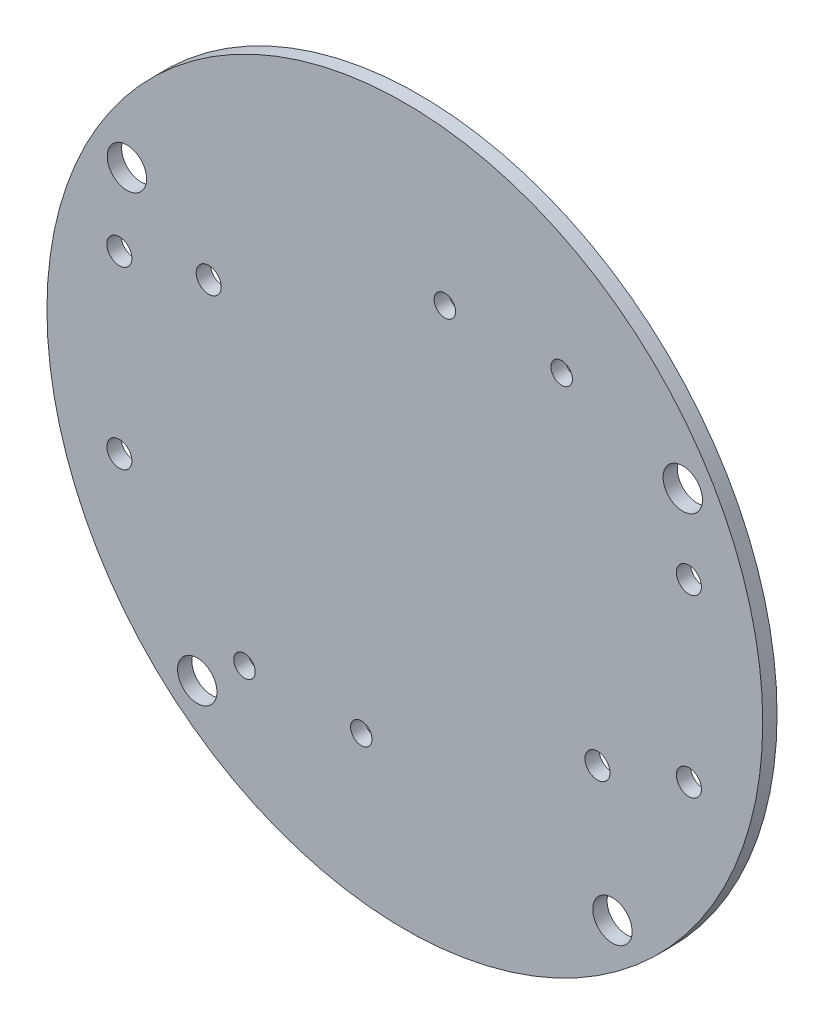
ISO-10303-21;
HEADER;
FILE_DESCRIPTION(('STEP AP214'),'2;1');
FILE_NAME('part.step','',(''),(''),'','','');
FILE_SCHEMA(('AUTOMOTIVE_DESIGN { 1 0 10303 214 1 1 1 1 }'));
ENDSEC;
DATA;
#1=APPLICATION_CONTEXT('core data for automotive mechanical design processes');
#2=APPLICATION_PROTOCOL_DEFINITION('international standard','automotive_design',2000,#1);
#3=PRODUCT_CONTEXT('',#1,'mechanical');
#4=PRODUCT('Part','Part','',(#3));
#5=PRODUCT_RELATED_PRODUCT_CATEGORY('part','',(#4));
#6=PRODUCT_DEFINITION_FORMATION('','',#4);
#7=PRODUCT_DEFINITION_CONTEXT('part definition',#1,'design');
#8=PRODUCT_DEFINITION('design','',#6,#7);
#9=PRODUCT_DEFINITION_SHAPE('','',#8);
#10=(LENGTH_UNIT() NAMED_UNIT(*) SI_UNIT(.MILLI.,.METRE.));
#11=(NAMED_UNIT(*) PLANE_ANGLE_UNIT() SI_UNIT($,.RADIAN.));
#12=(NAMED_UNIT(*) SI_UNIT($,.STERADIAN.) SOLID_ANGLE_UNIT());
#13=UNCERTAINTY_MEASURE_WITH_UNIT(LENGTH_MEASURE(1.E-05),#10,'distance_accuracy_value','');
#14=(GEOMETRIC_REPRESENTATION_CONTEXT(3) GLOBAL_UNCERTAINTY_ASSIGNED_CONTEXT((#13)) GLOBAL_UNIT_ASSIGNED_CONTEXT((#10,
#11,#12)) REPRESENTATION_CONTEXT('',''));
#15=CARTESIAN_POINT('',(0.,0.,0.));
#16=DIRECTION('',(0.,0.,1.));
#17=DIRECTION('',(1.,0.,0.));
#18=AXIS2_PLACEMENT_3D('',#15,#16,#17);
#19=CARTESIAN_POINT('',(0.,0.,2.));
#20=DIRECTION('',(0.,0.,-1.));
#21=DIRECTION('',(-1.,0.,0.));
#22=AXIS2_PLACEMENT_3D('',#19,#20,#21);
#23=CYLINDRICAL_SURFACE('',#22,50.);
#24=CARTESIAN_POINT('',(0.,0.,2.));
#25=DIRECTION('',(0.,0.,1.));
#26=DIRECTION('',(1.,0.,0.));
#27=AXIS2_PLACEMENT_3D('',#24,#25,#26);
#28=CIRCLE('',#27,50.);
#29=CARTESIAN_POINT('',(50.,0.,2.));
#30=VERTEX_POINT('',#29);
#31=EDGE_CURVE('E10',#30,#30,#28,.T.);
#32=ORIENTED_EDGE('',*,*,#31,.F.);
#33=EDGE_LOOP('',(#32));
#34=FACE_BOUND('',#33,.T.);
#35=CARTESIAN_POINT('',(0.,0.,0.));
#36=DIRECTION('',(0.,0.,1.));
#37=DIRECTION('',(1.,0.,0.));
#38=AXIS2_PLACEMENT_3D('',#35,#36,#37);
#39=CIRCLE('',#38,50.);
#40=CARTESIAN_POINT('',(50.,0.,0.));
#41=VERTEX_POINT('',#40);
#42=EDGE_CURVE('E49',#41,#41,#39,.T.);
#43=ORIENTED_EDGE('',*,*,#42,.T.);
#44=EDGE_LOOP('',(#43));
#45=FACE_BOUND('',#44,.T.);
#46=ADVANCED_FACE('F41',(#34,#45),#23,.T.);
#47=CARTESIAN_POINT('',(0.,0.,2.));
#48=DIRECTION('',(0.,0.,1.));
#49=DIRECTION('',(1.,0.,0.));
#50=AXIS2_PLACEMENT_3D('',#47,#48,#49);
#51=PLANE('',#50);
#52=CARTESIAN_POINT('',(39.68,-12.34,2.));
#53=DIRECTION('',(0.,0.,1.));
#54=DIRECTION('',(1.,0.,0.));
#55=AXIS2_PLACEMENT_3D('',#52,#53,#54);
#56=CIRCLE('',#55,1.75);
#57=CARTESIAN_POINT('',(41.43,-12.34,2.));
#58=VERTEX_POINT('',#57);
#59=EDGE_CURVE('E266',#58,#58,#56,.T.);
#60=ORIENTED_EDGE('',*,*,#59,.F.);
#61=EDGE_LOOP('',(#60));
#62=FACE_BOUND('',#61,.T.);
#63=CARTESIAN_POINT('',(5.59000000000001,28.28,2.));
#64=DIRECTION('',(0.,0.,1.));
#65=DIRECTION('',(1.,0.,0.));
#66=AXIS2_PLACEMENT_3D('',#63,#64,#65);
#67=CIRCLE('',#66,1.5);
#68=CARTESIAN_POINT('',(7.09000000000001,28.28,2.));
#69=VERTEX_POINT('',#68);
#70=EDGE_CURVE('E260',#69,#69,#67,.T.);
#71=ORIENTED_EDGE('',*,*,#70,.F.);
#72=EDGE_LOOP('',(#71));
#73=FACE_BOUND('',#72,.T.);
#74=CARTESIAN_POINT('',(21.91,28.28,2.));
#75=DIRECTION('',(0.,0.,1.));
#76=DIRECTION('',(1.,0.,0.));
#77=AXIS2_PLACEMENT_3D('',#74,#75,#76);
#78=CIRCLE('',#77,1.5);
#79=CARTESIAN_POINT('',(23.41,28.28,2.));
#80=VERTEX_POINT('',#79);
#81=EDGE_CURVE('E235',#80,#80,#78,.T.);
#82=ORIENTED_EDGE('',*,*,#81,.F.);
#83=EDGE_LOOP('',(#82));
#84=FACE_BOUND('',#83,.T.);
#85=CARTESIAN_POINT('',(-6.07999999999999,-29.3,2.));
#86=DIRECTION('',(0.,0.,1.));
#87=DIRECTION('',(1.,0.,0.));
#88=AXIS2_PLACEMENT_3D('',#85,#86,#87);
#89=CIRCLE('',#88,1.5);
#90=CARTESIAN_POINT('',(-4.57999999999999,-29.3,2.));
#91=VERTEX_POINT('',#90);
#92=EDGE_CURVE('E261',#91,#91,#89,.T.);
#93=ORIENTED_EDGE('',*,*,#92,.F.);
#94=EDGE_LOOP('',(#93));
#95=FACE_BOUND('',#94,.T.);
#96=CARTESIAN_POINT('',(39.68,12.16,2.));
#97=DIRECTION('',(0.,0.,1.));
#98=DIRECTION('',(1.,0.,0.));
#99=AXIS2_PLACEMENT_3D('',#96,#97,#98);
#100=CIRCLE('',#99,1.75);
#101=CARTESIAN_POINT('',(41.43,12.16,2.));
#102=VERTEX_POINT('',#101);
#103=EDGE_CURVE('E275',#102,#102,#100,.T.);
#104=ORIENTED_EDGE('',*,*,#103,.F.);
#105=EDGE_LOOP('',(#104));
#106=FACE_BOUND('',#105,.T.);
#107=CARTESIAN_POINT('',(-39.88,12.11,2.));
#108=DIRECTION('',(0.,0.,1.));
#109=DIRECTION('',(1.,0.,0.));
#110=AXIS2_PLACEMENT_3D('',#107,#108,#109);
#111=CIRCLE('',#110,1.75);
#112=CARTESIAN_POINT('',(-38.13,12.11,2.));
#113=VERTEX_POINT('',#112);
#114=EDGE_CURVE('E285',#113,#113,#111,.T.);
#115=ORIENTED_EDGE('',*,*,#114,.F.);
#116=EDGE_LOOP('',(#115));
#117=FACE_BOUND('',#116,.T.);
#118=CARTESIAN_POINT('',(-39.88,-12.4,2.));
#119=DIRECTION('',(0.,0.,1.));
#120=DIRECTION('',(1.,0.,0.));
#121=AXIS2_PLACEMENT_3D('',#118,#119,#120);
#122=CIRCLE('',#121,1.75);
#123=CARTESIAN_POINT('',(-38.13,-12.4,2.));
#124=VERTEX_POINT('',#123);
#125=EDGE_CURVE('E281',#124,#124,#122,.T.);
#126=ORIENTED_EDGE('',*,*,#125,.F.);
#127=EDGE_LOOP('',(#126));
#128=FACE_BOUND('',#127,.T.);
#129=CARTESIAN_POINT('',(26.91,-16.73,2.));
#130=DIRECTION('',(0.,0.,1.));
#131=DIRECTION('',(1.,0.,0.));
#132=AXIS2_PLACEMENT_3D('',#129,#130,#131);
#133=CIRCLE('',#132,1.75);
#134=CARTESIAN_POINT('',(28.66,-16.73,2.));
#135=VERTEX_POINT('',#134);
#136=EDGE_CURVE('E277',#135,#135,#133,.T.);
#137=ORIENTED_EDGE('',*,*,#136,.F.);
#138=EDGE_LOOP('',(#137));
#139=FACE_BOUND('',#138,.T.);
#140=CARTESIAN_POINT('',(-22.4,-29.3,2.));
#141=DIRECTION('',(0.,0.,1.));
#142=DIRECTION('',(1.,0.,0.));
#143=AXIS2_PLACEMENT_3D('',#140,#141,#142);
#144=CIRCLE('',#143,1.5);
#145=CARTESIAN_POINT('',(-20.9,-29.3,2.));
#146=VERTEX_POINT('',#145);
#147=EDGE_CURVE('E269',#146,#146,#144,.T.);
#148=ORIENTED_EDGE('',*,*,#147,.F.);
#149=EDGE_LOOP('',(#148));
#150=FACE_BOUND('',#149,.T.);
#151=CARTESIAN_POINT('',(-27.4,14.89,2.));
#152=DIRECTION('',(0.,0.,1.));
#153=DIRECTION('',(1.,0.,0.));
#154=AXIS2_PLACEMENT_3D('',#151,#152,#153);
#155=CIRCLE('',#154,1.75);
#156=CARTESIAN_POINT('',(-25.65,14.89,2.));
#157=VERTEX_POINT('',#156);
#158=EDGE_CURVE('E66',#157,#157,#155,.T.);
#159=ORIENTED_EDGE('',*,*,#158,.F.);
#160=EDGE_LOOP('',(#159));
#161=FACE_BOUND('',#160,.T.);
#162=CARTESIAN_POINT('',(38.8241975308642,22.7526193235952,2.));
#163=DIRECTION('',(0.,0.,1.));
#164=DIRECTION('',(1.,0.,0.));
#165=AXIS2_PLACEMENT_3D('',#162,#163,#164);
#166=CIRCLE('',#165,2.75);
#167=CARTESIAN_POINT('',(41.5741975308642,22.7526193235952,2.));
#168=VERTEX_POINT('',#167);
#169=EDGE_CURVE('E100',#168,#168,#166,.T.);
#170=ORIENTED_EDGE('',*,*,#169,.F.);
#171=EDGE_LOOP('',(#170));
#172=FACE_BOUND('',#171,.T.);
#173=CARTESIAN_POINT('',(-38.8241975308642,22.7526193235952,2.));
#174=DIRECTION('',(0.,0.,1.));
#175=DIRECTION('',(1.,0.,0.));
#176=AXIS2_PLACEMENT_3D('',#173,#174,#175);
#177=CIRCLE('',#176,2.75);
#178=CARTESIAN_POINT('',(-36.0741975308642,22.7526193235952,2.));
#179=VERTEX_POINT('',#178);
#180=EDGE_CURVE('E111',#179,#179,#177,.T.);
#181=ORIENTED_EDGE('',*,*,#180,.F.);
#182=EDGE_LOOP('',(#181));
#183=FACE_BOUND('',#182,.T.);
#184=CARTESIAN_POINT('',(29.,-34.4093010681705,2.));
#185=DIRECTION('',(0.,0.,1.));
#186=DIRECTION('',(1.,0.,0.));
#187=AXIS2_PLACEMENT_3D('',#184,#185,#186);
#188=CIRCLE('',#187,2.75);
#189=CARTESIAN_POINT('',(31.75,-34.4093010681705,2.));
#190=VERTEX_POINT('',#189);
#191=EDGE_CURVE('E125',#190,#190,#188,.T.);
#192=ORIENTED_EDGE('',*,*,#191,.F.);
#193=EDGE_LOOP('',(#192));
#194=FACE_BOUND('',#193,.T.);
#195=CARTESIAN_POINT('',(-29.,-34.4093010681705,2.));
#196=DIRECTION('',(0.,0.,1.));
#197=DIRECTION('',(1.,0.,0.));
#198=AXIS2_PLACEMENT_3D('',#195,#196,#197);
#199=CIRCLE('',#198,2.75);
#200=CARTESIAN_POINT('',(-26.25,-34.4093010681705,2.));
#201=VERTEX_POINT('',#200);
#202=EDGE_CURVE('E58',#201,#201,#199,.T.);
#203=ORIENTED_EDGE('',*,*,#202,.F.);
#204=EDGE_LOOP('',(#203));
#205=FACE_BOUND('',#204,.T.);
#206=ORIENTED_EDGE('',*,*,#31,.T.);
#207=EDGE_LOOP('',(#206));
#208=FACE_BOUND('',#207,.T.);
#209=ADVANCED_FACE('F144',(#62,#73,#84,#95,#106,#117,#128,#139,#150,#161,#172,#183,#194,#205,
#208),#51,.T.);
#210=CARTESIAN_POINT('',(0.,0.,0.));
#211=DIRECTION('',(0.,0.,1.));
#212=DIRECTION('',(1.,0.,0.));
#213=AXIS2_PLACEMENT_3D('',#210,#211,#212);
#214=PLANE('',#213);
#215=CARTESIAN_POINT('',(39.68,-12.34,0.));
#216=DIRECTION('',(0.,0.,1.));
#217=DIRECTION('',(1.,0.,0.));
#218=AXIS2_PLACEMENT_3D('',#215,#216,#217);
#219=CIRCLE('',#218,1.75);
#220=CARTESIAN_POINT('',(41.43,-12.34,0.));
#221=VERTEX_POINT('',#220);
#222=EDGE_CURVE('E44',#221,#221,#219,.T.);
#223=ORIENTED_EDGE('',*,*,#222,.T.);
#224=EDGE_LOOP('',(#223));
#225=FACE_BOUND('',#224,.T.);
#226=CARTESIAN_POINT('',(5.59000000000001,28.28,0.));
#227=DIRECTION('',(0.,0.,1.));
#228=DIRECTION('',(1.,0.,0.));
#229=AXIS2_PLACEMENT_3D('',#226,#227,#228);
#230=CIRCLE('',#229,1.5);
#231=CARTESIAN_POINT('',(7.09000000000001,28.28,0.));
#232=VERTEX_POINT('',#231);
#233=EDGE_CURVE('E93',#232,#232,#230,.T.);
#234=ORIENTED_EDGE('',*,*,#233,.T.);
#235=EDGE_LOOP('',(#234));
#236=FACE_BOUND('',#235,.T.);
#237=CARTESIAN_POINT('',(21.91,28.28,0.));
#238=DIRECTION('',(0.,0.,1.));
#239=DIRECTION('',(1.,0.,0.));
#240=AXIS2_PLACEMENT_3D('',#237,#238,#239);
#241=CIRCLE('',#240,1.5);
#242=CARTESIAN_POINT('',(23.41,28.28,0.));
#243=VERTEX_POINT('',#242);
#244=EDGE_CURVE('E90',#243,#243,#241,.T.);
#245=ORIENTED_EDGE('',*,*,#244,.T.);
#246=EDGE_LOOP('',(#245));
#247=FACE_BOUND('',#246,.T.);
#248=CARTESIAN_POINT('',(-6.07999999999999,-29.3,0.));
#249=DIRECTION('',(0.,0.,1.));
#250=DIRECTION('',(1.,0.,0.));
#251=AXIS2_PLACEMENT_3D('',#248,#249,#250);
#252=CIRCLE('',#251,1.5);
#253=CARTESIAN_POINT('',(-4.57999999999999,-29.3,0.));
#254=VERTEX_POINT('',#253);
#255=EDGE_CURVE('E86',#254,#254,#252,.T.);
#256=ORIENTED_EDGE('',*,*,#255,.T.);
#257=EDGE_LOOP('',(#256));
#258=FACE_BOUND('',#257,.T.);
#259=CARTESIAN_POINT('',(39.68,12.16,0.));
#260=DIRECTION('',(0.,0.,1.));
#261=DIRECTION('',(1.,0.,0.));
#262=AXIS2_PLACEMENT_3D('',#259,#260,#261);
#263=CIRCLE('',#262,1.75);
#264=CARTESIAN_POINT('',(41.43,12.16,0.));
#265=VERTEX_POINT('',#264);
#266=EDGE_CURVE('E82',#265,#265,#263,.T.);
#267=ORIENTED_EDGE('',*,*,#266,.T.);
#268=EDGE_LOOP('',(#267));
#269=FACE_BOUND('',#268,.T.);
#270=CARTESIAN_POINT('',(-39.88,12.11,0.));
#271=DIRECTION('',(0.,0.,1.));
#272=DIRECTION('',(1.,0.,0.));
#273=AXIS2_PLACEMENT_3D('',#270,#271,#272);
#274=CIRCLE('',#273,1.75);
#275=CARTESIAN_POINT('',(-38.13,12.11,0.));
#276=VERTEX_POINT('',#275);
#277=EDGE_CURVE('E78',#276,#276,#274,.T.);
#278=ORIENTED_EDGE('',*,*,#277,.T.);
#279=EDGE_LOOP('',(#278));
#280=FACE_BOUND('',#279,.T.);
#281=CARTESIAN_POINT('',(-39.88,-12.4,0.));
#282=DIRECTION('',(0.,0.,1.));
#283=DIRECTION('',(1.,0.,0.));
#284=AXIS2_PLACEMENT_3D('',#281,#282,#283);
#285=CIRCLE('',#284,1.75);
#286=CARTESIAN_POINT('',(-38.13,-12.4,0.));
#287=VERTEX_POINT('',#286);
#288=EDGE_CURVE('E74',#287,#287,#285,.T.);
#289=ORIENTED_EDGE('',*,*,#288,.T.);
#290=EDGE_LOOP('',(#289));
#291=FACE_BOUND('',#290,.T.);
#292=CARTESIAN_POINT('',(26.91,-16.73,0.));
#293=DIRECTION('',(0.,0.,1.));
#294=DIRECTION('',(1.,0.,0.));
#295=AXIS2_PLACEMENT_3D('',#292,#293,#294);
#296=CIRCLE('',#295,1.75);
#297=CARTESIAN_POINT('',(28.66,-16.73,0.));
#298=VERTEX_POINT('',#297);
#299=EDGE_CURVE('E70',#298,#298,#296,.T.);
#300=ORIENTED_EDGE('',*,*,#299,.T.);
#301=EDGE_LOOP('',(#300));
#302=FACE_BOUND('',#301,.T.);
#303=CARTESIAN_POINT('',(-22.4,-29.3,0.));
#304=DIRECTION('',(0.,0.,1.));
#305=DIRECTION('',(1.,0.,0.));
#306=AXIS2_PLACEMENT_3D('',#303,#304,#305);
#307=CIRCLE('',#306,1.5);
#308=CARTESIAN_POINT('',(-20.9,-29.3,0.));
#309=VERTEX_POINT('',#308);
#310=EDGE_CURVE('E65',#309,#309,#307,.T.);
#311=ORIENTED_EDGE('',*,*,#310,.T.);
#312=EDGE_LOOP('',(#311));
#313=FACE_BOUND('',#312,.T.);
#314=CARTESIAN_POINT('',(-27.4,14.89,0.));
#315=DIRECTION('',(0.,0.,1.));
#316=DIRECTION('',(1.,0.,0.));
#317=AXIS2_PLACEMENT_3D('',#314,#315,#316);
#318=CIRCLE('',#317,1.75);
#319=CARTESIAN_POINT('',(-25.65,14.89,0.));
#320=VERTEX_POINT('',#319);
#321=EDGE_CURVE('E61',#320,#320,#318,.T.);
#322=ORIENTED_EDGE('',*,*,#321,.T.);
#323=EDGE_LOOP('',(#322));
#324=FACE_BOUND('',#323,.T.);
#325=CARTESIAN_POINT('',(38.8241975308642,22.7526193235952,0.));
#326=DIRECTION('',(0.,0.,1.));
#327=DIRECTION('',(1.,0.,0.));
#328=AXIS2_PLACEMENT_3D('',#325,#326,#327);
#329=CIRCLE('',#328,2.75);
#330=CARTESIAN_POINT('',(41.5741975308642,22.7526193235952,0.));
#331=VERTEX_POINT('',#330);
#332=EDGE_CURVE('E105',#331,#331,#329,.T.);
#333=ORIENTED_EDGE('',*,*,#332,.T.);
#334=EDGE_LOOP('',(#333));
#335=FACE_BOUND('',#334,.T.);
#336=CARTESIAN_POINT('',(-38.8241975308642,22.7526193235952,0.));
#337=DIRECTION('',(0.,0.,1.));
#338=DIRECTION('',(1.,0.,0.));
#339=AXIS2_PLACEMENT_3D('',#336,#337,#338);
#340=CIRCLE('',#339,2.75);
#341=CARTESIAN_POINT('',(-36.0741975308642,22.7526193235952,0.));
#342=VERTEX_POINT('',#341);
#343=EDGE_CURVE('E131',#342,#342,#340,.T.);
#344=ORIENTED_EDGE('',*,*,#343,.T.);
#345=EDGE_LOOP('',(#344));
#346=FACE_BOUND('',#345,.T.);
#347=CARTESIAN_POINT('',(29.,-34.4093010681705,0.));
#348=DIRECTION('',(0.,0.,1.));
#349=DIRECTION('',(1.,0.,0.));
#350=AXIS2_PLACEMENT_3D('',#347,#348,#349);
#351=CIRCLE('',#350,2.75);
#352=CARTESIAN_POINT('',(31.75,-34.4093010681705,0.));
#353=VERTEX_POINT('',#352);
#354=EDGE_CURVE('E120',#353,#353,#351,.T.);
#355=ORIENTED_EDGE('',*,*,#354,.T.);
#356=EDGE_LOOP('',(#355));
#357=FACE_BOUND('',#356,.T.);
#358=CARTESIAN_POINT('',(-29.,-34.4093010681705,0.));
#359=DIRECTION('',(0.,0.,1.));
#360=DIRECTION('',(1.,0.,0.));
#361=AXIS2_PLACEMENT_3D('',#358,#359,#360);
#362=CIRCLE('',#361,2.75);
#363=CARTESIAN_POINT('',(-26.25,-34.4093010681705,0.));
#364=VERTEX_POINT('',#363);
#365=EDGE_CURVE('E55',#364,#364,#362,.T.);
#366=ORIENTED_EDGE('',*,*,#365,.T.);
#367=EDGE_LOOP('',(#366));
#368=FACE_BOUND('',#367,.T.);
#369=ORIENTED_EDGE('',*,*,#42,.F.);
#370=EDGE_LOOP('',(#369));
#371=FACE_BOUND('',#370,.T.);
#372=ADVANCED_FACE('F147',(#225,#236,#247,#258,#269,#280,#291,#302,#313,#324,#335,#346,#357,
#368,#371),#214,.F.);
#373=CARTESIAN_POINT('',(-29.,-34.4093010681705,0.));
#374=DIRECTION('',(0.,0.,1.));
#375=DIRECTION('',(1.,0.,0.));
#376=AXIS2_PLACEMENT_3D('',#373,#374,#375);
#377=CYLINDRICAL_SURFACE('',#376,2.75);
#378=ORIENTED_EDGE('',*,*,#365,.F.);
#379=EDGE_LOOP('',(#378));
#380=FACE_BOUND('',#379,.T.);
#381=ORIENTED_EDGE('',*,*,#202,.T.);
#382=EDGE_LOOP('',(#381));
#383=FACE_BOUND('',#382,.T.);
#384=ADVANCED_FACE('F155',(#380,#383),#377,.F.);
#385=CARTESIAN_POINT('',(29.,-34.4093010681705,0.));
#386=DIRECTION('',(0.,0.,1.));
#387=DIRECTION('',(1.,0.,0.));
#388=AXIS2_PLACEMENT_3D('',#385,#386,#387);
#389=CYLINDRICAL_SURFACE('',#388,2.75);
#390=ORIENTED_EDGE('',*,*,#354,.F.);
#391=EDGE_LOOP('',(#390));
#392=FACE_BOUND('',#391,.T.);
#393=ORIENTED_EDGE('',*,*,#191,.T.);
#394=EDGE_LOOP('',(#393));
#395=FACE_BOUND('',#394,.T.);
#396=ADVANCED_FACE('F153',(#392,#395),#389,.F.);
#397=CARTESIAN_POINT('',(-38.8241975308642,22.7526193235952,0.));
#398=DIRECTION('',(0.,0.,1.));
#399=DIRECTION('',(1.,0.,0.));
#400=AXIS2_PLACEMENT_3D('',#397,#398,#399);
#401=CYLINDRICAL_SURFACE('',#400,2.75);
#402=ORIENTED_EDGE('',*,*,#343,.F.);
#403=EDGE_LOOP('',(#402));
#404=FACE_BOUND('',#403,.T.);
#405=ORIENTED_EDGE('',*,*,#180,.T.);
#406=EDGE_LOOP('',(#405));
#407=FACE_BOUND('',#406,.T.);
#408=ADVANCED_FACE('F142',(#404,#407),#401,.F.);
#409=CARTESIAN_POINT('',(38.8241975308642,22.7526193235952,0.));
#410=DIRECTION('',(0.,0.,1.));
#411=DIRECTION('',(1.,0.,0.));
#412=AXIS2_PLACEMENT_3D('',#409,#410,#411);
#413=CYLINDRICAL_SURFACE('',#412,2.75);
#414=ORIENTED_EDGE('',*,*,#332,.F.);
#415=EDGE_LOOP('',(#414));
#416=FACE_BOUND('',#415,.T.);
#417=ORIENTED_EDGE('',*,*,#169,.T.);
#418=EDGE_LOOP('',(#417));
#419=FACE_BOUND('',#418,.T.);
#420=ADVANCED_FACE('F162',(#416,#419),#413,.F.);
#421=CARTESIAN_POINT('',(-27.4,14.89,-8.));
#422=DIRECTION('',(0.,0.,1.));
#423=DIRECTION('',(1.,0.,0.));
#424=AXIS2_PLACEMENT_3D('',#421,#422,#423);
#425=CYLINDRICAL_SURFACE('',#424,1.75);
#426=ORIENTED_EDGE('',*,*,#158,.T.);
#427=EDGE_LOOP('',(#426));
#428=FACE_BOUND('',#427,.T.);
#429=ORIENTED_EDGE('',*,*,#321,.F.);
#430=EDGE_LOOP('',(#429));
#431=FACE_BOUND('',#430,.T.);
#432=ADVANCED_FACE('F180',(#428,#431),#425,.F.);
#433=CARTESIAN_POINT('',(-22.4,-29.3,-8.));
#434=DIRECTION('',(0.,0.,1.));
#435=DIRECTION('',(1.,0.,0.));
#436=AXIS2_PLACEMENT_3D('',#433,#434,#435);
#437=CYLINDRICAL_SURFACE('',#436,1.5);
#438=ORIENTED_EDGE('',*,*,#147,.T.);
#439=EDGE_LOOP('',(#438));
#440=FACE_BOUND('',#439,.T.);
#441=ORIENTED_EDGE('',*,*,#310,.F.);
#442=EDGE_LOOP('',(#441));
#443=FACE_BOUND('',#442,.T.);
#444=ADVANCED_FACE('F185',(#440,#443),#437,.F.);
#445=CARTESIAN_POINT('',(26.91,-16.73,-8.));
#446=DIRECTION('',(0.,0.,1.));
#447=DIRECTION('',(1.,0.,0.));
#448=AXIS2_PLACEMENT_3D('',#445,#446,#447);
#449=CYLINDRICAL_SURFACE('',#448,1.75);
#450=ORIENTED_EDGE('',*,*,#136,.T.);
#451=EDGE_LOOP('',(#450));
#452=FACE_BOUND('',#451,.T.);
#453=ORIENTED_EDGE('',*,*,#299,.F.);
#454=EDGE_LOOP('',(#453));
#455=FACE_BOUND('',#454,.T.);
#456=ADVANCED_FACE('F194',(#452,#455),#449,.F.);
#457=CARTESIAN_POINT('',(-39.88,-12.4,-8.));
#458=DIRECTION('',(0.,0.,1.));
#459=DIRECTION('',(1.,0.,0.));
#460=AXIS2_PLACEMENT_3D('',#457,#458,#459);
#461=CYLINDRICAL_SURFACE('',#460,1.75);
#462=ORIENTED_EDGE('',*,*,#125,.T.);
#463=EDGE_LOOP('',(#462));
#464=FACE_BOUND('',#463,.T.);
#465=ORIENTED_EDGE('',*,*,#288,.F.);
#466=EDGE_LOOP('',(#465));
#467=FACE_BOUND('',#466,.T.);
#468=ADVANCED_FACE('F208',(#464,#467),#461,.F.);
#469=CARTESIAN_POINT('',(-39.88,12.11,-8.));
#470=DIRECTION('',(0.,0.,1.));
#471=DIRECTION('',(1.,0.,0.));
#472=AXIS2_PLACEMENT_3D('',#469,#470,#471);
#473=CYLINDRICAL_SURFACE('',#472,1.75);
#474=ORIENTED_EDGE('',*,*,#114,.T.);
#475=EDGE_LOOP('',(#474));
#476=FACE_BOUND('',#475,.T.);
#477=ORIENTED_EDGE('',*,*,#277,.F.);
#478=EDGE_LOOP('',(#477));
#479=FACE_BOUND('',#478,.T.);
#480=ADVANCED_FACE('F204',(#476,#479),#473,.F.);
#481=CARTESIAN_POINT('',(39.68,12.16,-8.));
#482=DIRECTION('',(0.,0.,1.));
#483=DIRECTION('',(1.,0.,0.));
#484=AXIS2_PLACEMENT_3D('',#481,#482,#483);
#485=CYLINDRICAL_SURFACE('',#484,1.75);
#486=ORIENTED_EDGE('',*,*,#103,.T.);
#487=EDGE_LOOP('',(#486));
#488=FACE_BOUND('',#487,.T.);
#489=ORIENTED_EDGE('',*,*,#266,.F.);
#490=EDGE_LOOP('',(#489));
#491=FACE_BOUND('',#490,.T.);
#492=ADVANCED_FACE('F200',(#488,#491),#485,.F.);
#493=CARTESIAN_POINT('',(-6.07999999999999,-29.3,-8.));
#494=DIRECTION('',(0.,0.,1.));
#495=DIRECTION('',(1.,0.,0.));
#496=AXIS2_PLACEMENT_3D('',#493,#494,#495);
#497=CYLINDRICAL_SURFACE('',#496,1.5);
#498=ORIENTED_EDGE('',*,*,#92,.T.);
#499=EDGE_LOOP('',(#498));
#500=FACE_BOUND('',#499,.T.);
#501=ORIENTED_EDGE('',*,*,#255,.F.);
#502=EDGE_LOOP('',(#501));
#503=FACE_BOUND('',#502,.T.);
#504=ADVANCED_FACE('F203',(#500,#503),#497,.F.);
#505=CARTESIAN_POINT('',(21.91,28.28,-8.));
#506=DIRECTION('',(0.,0.,1.));
#507=DIRECTION('',(1.,0.,0.));
#508=AXIS2_PLACEMENT_3D('',#505,#506,#507);
#509=CYLINDRICAL_SURFACE('',#508,1.5);
#510=ORIENTED_EDGE('',*,*,#81,.T.);
#511=EDGE_LOOP('',(#510));
#512=FACE_BOUND('',#511,.T.);
#513=ORIENTED_EDGE('',*,*,#244,.F.);
#514=EDGE_LOOP('',(#513));
#515=FACE_BOUND('',#514,.T.);
#516=ADVANCED_FACE('F220',(#512,#515),#509,.F.);
#517=CARTESIAN_POINT('',(5.59000000000001,28.28,-8.));
#518=DIRECTION('',(0.,0.,1.));
#519=DIRECTION('',(1.,0.,0.));
#520=AXIS2_PLACEMENT_3D('',#517,#518,#519);
#521=CYLINDRICAL_SURFACE('',#520,1.5);
#522=ORIENTED_EDGE('',*,*,#70,.T.);
#523=EDGE_LOOP('',(#522));
#524=FACE_BOUND('',#523,.T.);
#525=ORIENTED_EDGE('',*,*,#233,.F.);
#526=EDGE_LOOP('',(#525));
#527=FACE_BOUND('',#526,.T.);
#528=ADVANCED_FACE('F216',(#524,#527),#521,.F.);
#529=CARTESIAN_POINT('',(39.68,-12.34,-8.));
#530=DIRECTION('',(0.,0.,1.));
#531=DIRECTION('',(1.,0.,0.));
#532=AXIS2_PLACEMENT_3D('',#529,#530,#531);
#533=CYLINDRICAL_SURFACE('',#532,1.75);
#534=ORIENTED_EDGE('',*,*,#59,.T.);
#535=EDGE_LOOP('',(#534));
#536=FACE_BOUND('',#535,.T.);
#537=ORIENTED_EDGE('',*,*,#222,.F.);
#538=EDGE_LOOP('',(#537));
#539=FACE_BOUND('',#538,.T.);
#540=ADVANCED_FACE('F219',(#536,#539),#533,.F.);
#541=CLOSED_SHELL('',(#46,#209,#372,#384,#396,#408,#420,#432,#444,#456,#468,#480,#492,#504,#516,
#528,#540));
#542=MANIFOLD_SOLID_BREP('B2',#541);
#543=ADVANCED_BREP_SHAPE_REPRESENTATION('',(#18,#542),#14);
#544=SHAPE_DEFINITION_REPRESENTATION(#9,#543);
ENDSEC;
END-ISO-10303-21;
